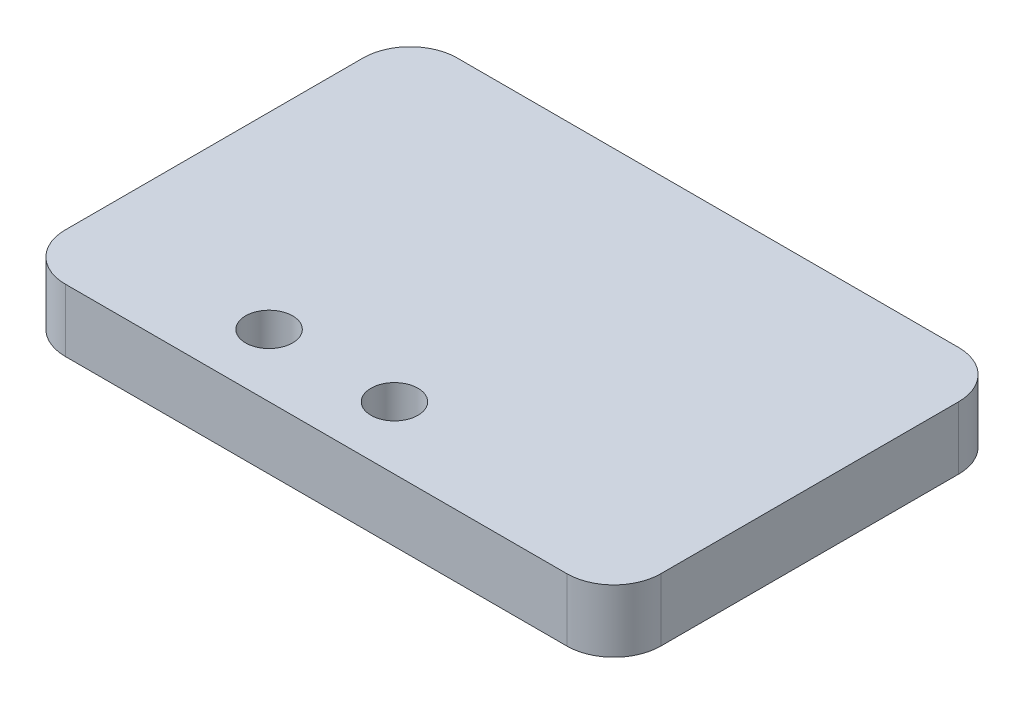
ISO-10303-21;
HEADER;
FILE_DESCRIPTION(('STEP AP214'),'2;1');
FILE_NAME('part.step','',(''),(''),'','','');
FILE_SCHEMA(('AUTOMOTIVE_DESIGN { 1 0 10303 214 1 1 1 1 }'));
ENDSEC;
DATA;
#1=APPLICATION_CONTEXT('core data for automotive mechanical design processes');
#2=APPLICATION_PROTOCOL_DEFINITION('international standard','automotive_design',2000,#1);
#3=PRODUCT_CONTEXT('',#1,'mechanical');
#4=PRODUCT('Part','Part','',(#3));
#5=PRODUCT_RELATED_PRODUCT_CATEGORY('part','',(#4));
#6=PRODUCT_DEFINITION_FORMATION('','',#4);
#7=PRODUCT_DEFINITION_CONTEXT('part definition',#1,'design');
#8=PRODUCT_DEFINITION('design','',#6,#7);
#9=PRODUCT_DEFINITION_SHAPE('','',#8);
#10=(LENGTH_UNIT() NAMED_UNIT(*) SI_UNIT(.MILLI.,.METRE.));
#11=(NAMED_UNIT(*) PLANE_ANGLE_UNIT() SI_UNIT($,.RADIAN.));
#12=(NAMED_UNIT(*) SI_UNIT($,.STERADIAN.) SOLID_ANGLE_UNIT());
#13=UNCERTAINTY_MEASURE_WITH_UNIT(LENGTH_MEASURE(1.E-05),#10,'distance_accuracy_value','');
#14=(GEOMETRIC_REPRESENTATION_CONTEXT(3) GLOBAL_UNCERTAINTY_ASSIGNED_CONTEXT((#13)) GLOBAL_UNIT_ASSIGNED_CONTEXT((#10,
#11,#12)) REPRESENTATION_CONTEXT('',''));
#15=CARTESIAN_POINT('',(0.,0.,0.));
#16=DIRECTION('',(0.,0.,1.));
#17=DIRECTION('',(1.,0.,0.));
#18=AXIS2_PLACEMENT_3D('',#15,#16,#17);
#19=CARTESIAN_POINT('',(0.,4.,12.5));
#20=DIRECTION('',(0.,0.,-1.));
#21=DIRECTION('',(-1.,0.,0.));
#22=AXIS2_PLACEMENT_3D('',#19,#20,#21);
#23=PLANE('',#22);
#24=DIRECTION('',(1.,0.,0.));
#25=VECTOR('',#24,1.);
#26=CARTESIAN_POINT('',(0.,0.,12.5));
#27=LINE('',#26,#25);
#28=CARTESIAN_POINT('',(-16.,0.,12.5));
#29=VERTEX_POINT('',#28);
#30=CARTESIAN_POINT('',(16.,0.,12.5));
#31=VERTEX_POINT('',#30);
#32=EDGE_CURVE('E114',#29,#31,#27,.T.);
#33=ORIENTED_EDGE('',*,*,#32,.T.);
#34=DIRECTION('',(0.,-1.,0.));
#35=VECTOR('',#34,1.);
#36=CARTESIAN_POINT('',(16.,4.,12.5));
#37=LINE('',#36,#35);
#38=CARTESIAN_POINT('',(16.,4.,12.5));
#39=VERTEX_POINT('',#38);
#40=EDGE_CURVE('E11',#31,#39,#37,.F.);
#41=ORIENTED_EDGE('',*,*,#40,.T.);
#42=DIRECTION('',(1.,0.,0.));
#43=VECTOR('',#42,1.);
#44=CARTESIAN_POINT('',(0.,4.,12.5));
#45=LINE('',#44,#43);
#46=CARTESIAN_POINT('',(-16.,4.,12.5));
#47=VERTEX_POINT('',#46);
#48=EDGE_CURVE('E163',#47,#39,#45,.T.);
#49=ORIENTED_EDGE('',*,*,#48,.F.);
#50=DIRECTION('',(0.,-1.,0.));
#51=VECTOR('',#50,1.);
#52=CARTESIAN_POINT('',(-16.,0.,12.5));
#53=LINE('',#52,#51);
#54=EDGE_CURVE('E51',#47,#29,#53,.T.);
#55=ORIENTED_EDGE('',*,*,#54,.T.);
#56=EDGE_LOOP('',(#33,#41,#49,#55));
#57=FACE_BOUND('',#56,.T.);
#58=ADVANCED_FACE('F43',(#57),#23,.F.);
#59=CARTESIAN_POINT('',(19.,4.,0.));
#60=DIRECTION('',(-1.,0.,0.));
#61=DIRECTION('',(0.,0.,1.));
#62=AXIS2_PLACEMENT_3D('',#59,#60,#61);
#63=PLANE('',#62);
#64=DIRECTION('',(0.,0.,-1.));
#65=VECTOR('',#64,1.);
#66=CARTESIAN_POINT('',(19.,0.,0.));
#67=LINE('',#66,#65);
#68=CARTESIAN_POINT('',(19.,0.,9.5));
#69=VERTEX_POINT('',#68);
#70=CARTESIAN_POINT('',(19.,0.,-9.5));
#71=VERTEX_POINT('',#70);
#72=EDGE_CURVE('E181',#69,#71,#67,.T.);
#73=ORIENTED_EDGE('',*,*,#72,.T.);
#74=DIRECTION('',(0.,-1.,0.));
#75=VECTOR('',#74,1.);
#76=CARTESIAN_POINT('',(19.,4.,-9.5));
#77=LINE('',#76,#75);
#78=CARTESIAN_POINT('',(19.,4.,-9.5));
#79=VERTEX_POINT('',#78);
#80=EDGE_CURVE('E58',#71,#79,#77,.F.);
#81=ORIENTED_EDGE('',*,*,#80,.T.);
#82=DIRECTION('',(0.,0.,-1.));
#83=VECTOR('',#82,1.);
#84=CARTESIAN_POINT('',(19.,4.,0.));
#85=LINE('',#84,#83);
#86=CARTESIAN_POINT('',(19.,4.,9.5));
#87=VERTEX_POINT('',#86);
#88=EDGE_CURVE('E164',#87,#79,#85,.T.);
#89=ORIENTED_EDGE('',*,*,#88,.F.);
#90=DIRECTION('',(0.,-1.,0.));
#91=VECTOR('',#90,1.);
#92=CARTESIAN_POINT('',(19.,4.,9.5));
#93=LINE('',#92,#91);
#94=EDGE_CURVE('E157',#87,#69,#93,.T.);
#95=ORIENTED_EDGE('',*,*,#94,.T.);
#96=EDGE_LOOP('',(#73,#81,#89,#95));
#97=FACE_BOUND('',#96,.T.);
#98=ADVANCED_FACE('F207',(#97),#63,.F.);
#99=CARTESIAN_POINT('',(0.,4.,-12.5));
#100=DIRECTION('',(0.,0.,-1.));
#101=DIRECTION('',(-1.,0.,0.));
#102=AXIS2_PLACEMENT_3D('',#99,#100,#101);
#103=PLANE('',#102);
#104=DIRECTION('',(1.,0.,0.));
#105=VECTOR('',#104,1.);
#106=CARTESIAN_POINT('',(0.,0.,-12.5));
#107=LINE('',#106,#105);
#108=CARTESIAN_POINT('',(-16.,0.,-12.5));
#109=VERTEX_POINT('',#108);
#110=CARTESIAN_POINT('',(16.,0.,-12.5));
#111=VERTEX_POINT('',#110);
#112=EDGE_CURVE('E130',#109,#111,#107,.T.);
#113=ORIENTED_EDGE('',*,*,#112,.F.);
#114=DIRECTION('',(0.,-1.,0.));
#115=VECTOR('',#114,1.);
#116=CARTESIAN_POINT('',(-16.,4.,-12.5));
#117=LINE('',#116,#115);
#118=CARTESIAN_POINT('',(-16.,4.,-12.5));
#119=VERTEX_POINT('',#118);
#120=EDGE_CURVE('E149',#109,#119,#117,.F.);
#121=ORIENTED_EDGE('',*,*,#120,.T.);
#122=DIRECTION('',(1.,0.,0.));
#123=VECTOR('',#122,1.);
#124=CARTESIAN_POINT('',(0.,4.,-12.5));
#125=LINE('',#124,#123);
#126=CARTESIAN_POINT('',(16.,4.,-12.5));
#127=VERTEX_POINT('',#126);
#128=EDGE_CURVE('E137',#119,#127,#125,.T.);
#129=ORIENTED_EDGE('',*,*,#128,.T.);
#130=DIRECTION('',(0.,-1.,0.));
#131=VECTOR('',#130,1.);
#132=CARTESIAN_POINT('',(16.,0.,-12.5));
#133=LINE('',#132,#131);
#134=EDGE_CURVE('E146',#127,#111,#133,.T.);
#135=ORIENTED_EDGE('',*,*,#134,.T.);
#136=EDGE_LOOP('',(#113,#121,#129,#135));
#137=FACE_BOUND('',#136,.T.);
#138=ADVANCED_FACE('F187',(#137),#103,.T.);
#139=CARTESIAN_POINT('',(-6.99999999999999,4.,8.5));
#140=DIRECTION('',(0.,-1.,0.));
#141=DIRECTION('',(0.,0.,-1.));
#142=AXIS2_PLACEMENT_3D('',#139,#140,#141);
#143=CYLINDRICAL_SURFACE('',#142,1.5);
#144=CARTESIAN_POINT('',(-6.99999999999999,4.,8.5));
#145=DIRECTION('',(0.,1.,0.));
#146=DIRECTION('',(0.,0.,1.));
#147=AXIS2_PLACEMENT_3D('',#144,#145,#146);
#148=CIRCLE('',#147,1.5);
#149=CARTESIAN_POINT('',(-6.99999999999999,4.,10.));
#150=VERTEX_POINT('',#149);
#151=EDGE_CURVE('E165',#150,#150,#148,.T.);
#152=ORIENTED_EDGE('',*,*,#151,.T.);
#153=EDGE_LOOP('',(#152));
#154=FACE_BOUND('',#153,.T.);
#155=CARTESIAN_POINT('',(-6.99999999999999,0.,8.5));
#156=DIRECTION('',(0.,1.,0.));
#157=DIRECTION('',(0.,0.,1.));
#158=AXIS2_PLACEMENT_3D('',#155,#156,#157);
#159=CIRCLE('',#158,1.5);
#160=CARTESIAN_POINT('',(-6.99999999999999,0.,10.));
#161=VERTEX_POINT('',#160);
#162=EDGE_CURVE('E177',#161,#161,#159,.T.);
#163=ORIENTED_EDGE('',*,*,#162,.F.);
#164=EDGE_LOOP('',(#163));
#165=FACE_BOUND('',#164,.T.);
#166=ADVANCED_FACE('F216',(#154,#165),#143,.F.);
#167=CARTESIAN_POINT('',(1.00000000000001,4.,8.5));
#168=DIRECTION('',(0.,-1.,0.));
#169=DIRECTION('',(0.,0.,-1.));
#170=AXIS2_PLACEMENT_3D('',#167,#168,#169);
#171=CYLINDRICAL_SURFACE('',#170,1.5);
#172=CARTESIAN_POINT('',(1.00000000000001,4.,8.5));
#173=DIRECTION('',(0.,1.,0.));
#174=DIRECTION('',(0.,0.,1.));
#175=AXIS2_PLACEMENT_3D('',#172,#173,#174);
#176=CIRCLE('',#175,1.5);
#177=CARTESIAN_POINT('',(1.00000000000001,4.,10.));
#178=VERTEX_POINT('',#177);
#179=EDGE_CURVE('E129',#178,#178,#176,.T.);
#180=ORIENTED_EDGE('',*,*,#179,.T.);
#181=EDGE_LOOP('',(#180));
#182=FACE_BOUND('',#181,.T.);
#183=CARTESIAN_POINT('',(1.00000000000001,0.,8.5));
#184=DIRECTION('',(0.,1.,0.));
#185=DIRECTION('',(0.,0.,1.));
#186=AXIS2_PLACEMENT_3D('',#183,#184,#185);
#187=CIRCLE('',#186,1.5);
#188=CARTESIAN_POINT('',(1.00000000000001,0.,10.));
#189=VERTEX_POINT('',#188);
#190=EDGE_CURVE('E174',#189,#189,#187,.T.);
#191=ORIENTED_EDGE('',*,*,#190,.F.);
#192=EDGE_LOOP('',(#191));
#193=FACE_BOUND('',#192,.T.);
#194=ADVANCED_FACE('F219',(#182,#193),#171,.F.);
#195=CARTESIAN_POINT('',(-19.,4.,0.));
#196=DIRECTION('',(-1.,0.,0.));
#197=DIRECTION('',(0.,0.,1.));
#198=AXIS2_PLACEMENT_3D('',#195,#196,#197);
#199=PLANE('',#198);
#200=DIRECTION('',(0.,0.,-1.));
#201=VECTOR('',#200,1.);
#202=CARTESIAN_POINT('',(-19.,4.,0.));
#203=LINE('',#202,#201);
#204=CARTESIAN_POINT('',(-19.,4.,9.5));
#205=VERTEX_POINT('',#204);
#206=CARTESIAN_POINT('',(-19.,4.,-9.5));
#207=VERTEX_POINT('',#206);
#208=EDGE_CURVE('E134',#205,#207,#203,.T.);
#209=ORIENTED_EDGE('',*,*,#208,.T.);
#210=DIRECTION('',(0.,-1.,0.));
#211=VECTOR('',#210,1.);
#212=CARTESIAN_POINT('',(-19.,4.,-9.5));
#213=LINE('',#212,#211);
#214=CARTESIAN_POINT('',(-19.,0.,-9.5));
#215=VERTEX_POINT('',#214);
#216=EDGE_CURVE('E120',#207,#215,#213,.T.);
#217=ORIENTED_EDGE('',*,*,#216,.T.);
#218=DIRECTION('',(0.,0.,-1.));
#219=VECTOR('',#218,1.);
#220=CARTESIAN_POINT('',(-19.,0.,0.));
#221=LINE('',#220,#219);
#222=CARTESIAN_POINT('',(-19.,0.,9.5));
#223=VERTEX_POINT('',#222);
#224=EDGE_CURVE('E112',#223,#215,#221,.T.);
#225=ORIENTED_EDGE('',*,*,#224,.F.);
#226=DIRECTION('',(0.,-1.,0.));
#227=VECTOR('',#226,1.);
#228=CARTESIAN_POINT('',(-19.,4.,9.5));
#229=LINE('',#228,#227);
#230=EDGE_CURVE('E126',#223,#205,#229,.F.);
#231=ORIENTED_EDGE('',*,*,#230,.T.);
#232=EDGE_LOOP('',(#209,#217,#225,#231));
#233=FACE_BOUND('',#232,.T.);
#234=ADVANCED_FACE('F125',(#233),#199,.T.);
#235=CARTESIAN_POINT('',(0.,4.,0.));
#236=DIRECTION('',(0.,1.,0.));
#237=DIRECTION('',(0.,0.,1.));
#238=AXIS2_PLACEMENT_3D('',#235,#236,#237);
#239=PLANE('',#238);
#240=ORIENTED_EDGE('',*,*,#179,.F.);
#241=EDGE_LOOP('',(#240));
#242=FACE_BOUND('',#241,.T.);
#243=ORIENTED_EDGE('',*,*,#151,.F.);
#244=EDGE_LOOP('',(#243));
#245=FACE_BOUND('',#244,.T.);
#246=ORIENTED_EDGE('',*,*,#128,.F.);
#247=CARTESIAN_POINT('',(-16.,4.,-9.5));
#248=DIRECTION('',(0.,1.,0.));
#249=DIRECTION('',(0.,0.,1.));
#250=AXIS2_PLACEMENT_3D('',#247,#248,#249);
#251=CIRCLE('',#250,3.);
#252=EDGE_CURVE('E155',#119,#207,#251,.T.);
#253=ORIENTED_EDGE('',*,*,#252,.T.);
#254=ORIENTED_EDGE('',*,*,#208,.F.);
#255=CARTESIAN_POINT('',(-16.,4.,9.5));
#256=DIRECTION('',(0.,1.,0.));
#257=DIRECTION('',(0.,0.,1.));
#258=AXIS2_PLACEMENT_3D('',#255,#256,#257);
#259=CIRCLE('',#258,3.);
#260=EDGE_CURVE('E133',#205,#47,#259,.T.);
#261=ORIENTED_EDGE('',*,*,#260,.T.);
#262=ORIENTED_EDGE('',*,*,#48,.T.);
#263=CARTESIAN_POINT('',(16.,4.,9.5));
#264=DIRECTION('',(0.,1.,0.));
#265=DIRECTION('',(0.,0.,1.));
#266=AXIS2_PLACEMENT_3D('',#263,#264,#265);
#267=CIRCLE('',#266,3.);
#268=EDGE_CURVE('E65',#39,#87,#267,.T.);
#269=ORIENTED_EDGE('',*,*,#268,.T.);
#270=ORIENTED_EDGE('',*,*,#88,.T.);
#271=CARTESIAN_POINT('',(16.,4.,-9.5));
#272=DIRECTION('',(0.,1.,0.));
#273=DIRECTION('',(0.,0.,1.));
#274=AXIS2_PLACEMENT_3D('',#271,#272,#273);
#275=CIRCLE('',#274,3.);
#276=EDGE_CURVE('E153',#79,#127,#275,.T.);
#277=ORIENTED_EDGE('',*,*,#276,.T.);
#278=EDGE_LOOP('',(#246,#253,#254,#261,#262,#269,#270,#277));
#279=FACE_BOUND('',#278,.T.);
#280=ADVANCED_FACE('F193',(#242,#245,#279),#239,.T.);
#281=CARTESIAN_POINT('',(0.,0.,0.));
#282=DIRECTION('',(0.,1.,0.));
#283=DIRECTION('',(0.,0.,1.));
#284=AXIS2_PLACEMENT_3D('',#281,#282,#283);
#285=PLANE('',#284);
#286=ORIENTED_EDGE('',*,*,#190,.T.);
#287=EDGE_LOOP('',(#286));
#288=FACE_BOUND('',#287,.T.);
#289=ORIENTED_EDGE('',*,*,#162,.T.);
#290=EDGE_LOOP('',(#289));
#291=FACE_BOUND('',#290,.T.);
#292=ORIENTED_EDGE('',*,*,#224,.T.);
#293=CARTESIAN_POINT('',(-16.,0.,-9.5));
#294=DIRECTION('',(0.,1.,0.));
#295=DIRECTION('',(0.,0.,1.));
#296=AXIS2_PLACEMENT_3D('',#293,#294,#295);
#297=CIRCLE('',#296,3.);
#298=EDGE_CURVE('E144',#215,#109,#297,.F.);
#299=ORIENTED_EDGE('',*,*,#298,.T.);
#300=ORIENTED_EDGE('',*,*,#112,.T.);
#301=CARTESIAN_POINT('',(16.,0.,-9.5));
#302=DIRECTION('',(0.,1.,0.));
#303=DIRECTION('',(0.,0.,1.));
#304=AXIS2_PLACEMENT_3D('',#301,#302,#303);
#305=CIRCLE('',#304,3.);
#306=EDGE_CURVE('E142',#111,#71,#305,.F.);
#307=ORIENTED_EDGE('',*,*,#306,.T.);
#308=ORIENTED_EDGE('',*,*,#72,.F.);
#309=CARTESIAN_POINT('',(16.,0.,9.5));
#310=DIRECTION('',(0.,1.,0.));
#311=DIRECTION('',(0.,0.,1.));
#312=AXIS2_PLACEMENT_3D('',#309,#310,#311);
#313=CIRCLE('',#312,3.);
#314=EDGE_CURVE('E119',#69,#31,#313,.F.);
#315=ORIENTED_EDGE('',*,*,#314,.T.);
#316=ORIENTED_EDGE('',*,*,#32,.F.);
#317=CARTESIAN_POINT('',(-16.,0.,9.5));
#318=DIRECTION('',(0.,1.,0.));
#319=DIRECTION('',(0.,0.,1.));
#320=AXIS2_PLACEMENT_3D('',#317,#318,#319);
#321=CIRCLE('',#320,3.);
#322=EDGE_CURVE('E109',#29,#223,#321,.F.);
#323=ORIENTED_EDGE('',*,*,#322,.T.);
#324=EDGE_LOOP('',(#292,#299,#300,#307,#308,#315,#316,#323));
#325=FACE_BOUND('',#324,.T.);
#326=ADVANCED_FACE('F111',(#288,#291,#325),#285,.F.);
#327=CARTESIAN_POINT('',(-16.,4.,-9.5));
#328=DIRECTION('',(0.,-1.,0.));
#329=DIRECTION('',(0.,0.,-1.));
#330=AXIS2_PLACEMENT_3D('',#327,#328,#329);
#331=CYLINDRICAL_SURFACE('',#330,3.);
#332=ORIENTED_EDGE('',*,*,#252,.F.);
#333=ORIENTED_EDGE('',*,*,#120,.F.);
#334=ORIENTED_EDGE('',*,*,#298,.F.);
#335=ORIENTED_EDGE('',*,*,#216,.F.);
#336=EDGE_LOOP('',(#332,#333,#334,#335));
#337=FACE_BOUND('',#336,.T.);
#338=ADVANCED_FACE('F192',(#337),#331,.T.);
#339=CARTESIAN_POINT('',(16.,4.,-9.5));
#340=DIRECTION('',(0.,1.,0.));
#341=DIRECTION('',(0.,0.,1.));
#342=AXIS2_PLACEMENT_3D('',#339,#340,#341);
#343=CYLINDRICAL_SURFACE('',#342,3.);
#344=ORIENTED_EDGE('',*,*,#276,.F.);
#345=ORIENTED_EDGE('',*,*,#80,.F.);
#346=ORIENTED_EDGE('',*,*,#306,.F.);
#347=ORIENTED_EDGE('',*,*,#134,.F.);
#348=EDGE_LOOP('',(#344,#345,#346,#347));
#349=FACE_BOUND('',#348,.T.);
#350=ADVANCED_FACE('F196',(#349),#343,.T.);
#351=CARTESIAN_POINT('',(16.,4.,9.5));
#352=DIRECTION('',(0.,-1.,0.));
#353=DIRECTION('',(0.,0.,-1.));
#354=AXIS2_PLACEMENT_3D('',#351,#352,#353);
#355=CYLINDRICAL_SURFACE('',#354,3.);
#356=ORIENTED_EDGE('',*,*,#268,.F.);
#357=ORIENTED_EDGE('',*,*,#40,.F.);
#358=ORIENTED_EDGE('',*,*,#314,.F.);
#359=ORIENTED_EDGE('',*,*,#94,.F.);
#360=EDGE_LOOP('',(#356,#357,#358,#359));
#361=FACE_BOUND('',#360,.T.);
#362=ADVANCED_FACE('F198',(#361),#355,.T.);
#363=CARTESIAN_POINT('',(-16.,4.,9.5));
#364=DIRECTION('',(0.,1.,0.));
#365=DIRECTION('',(0.,0.,1.));
#366=AXIS2_PLACEMENT_3D('',#363,#364,#365);
#367=CYLINDRICAL_SURFACE('',#366,3.);
#368=ORIENTED_EDGE('',*,*,#260,.F.);
#369=ORIENTED_EDGE('',*,*,#230,.F.);
#370=ORIENTED_EDGE('',*,*,#322,.F.);
#371=ORIENTED_EDGE('',*,*,#54,.F.);
#372=EDGE_LOOP('',(#368,#369,#370,#371));
#373=FACE_BOUND('',#372,.T.);
#374=ADVANCED_FACE('F45',(#373),#367,.T.);
#375=CLOSED_SHELL('',(#58,#98,#138,#166,#194,#234,#280,#326,#338,#350,#362,#374));
#376=MANIFOLD_SOLID_BREP('B2',#375);
#377=ADVANCED_BREP_SHAPE_REPRESENTATION('',(#18,#376),#14);
#378=SHAPE_DEFINITION_REPRESENTATION(#9,#377);
ENDSEC;
END-ISO-10303-21;
